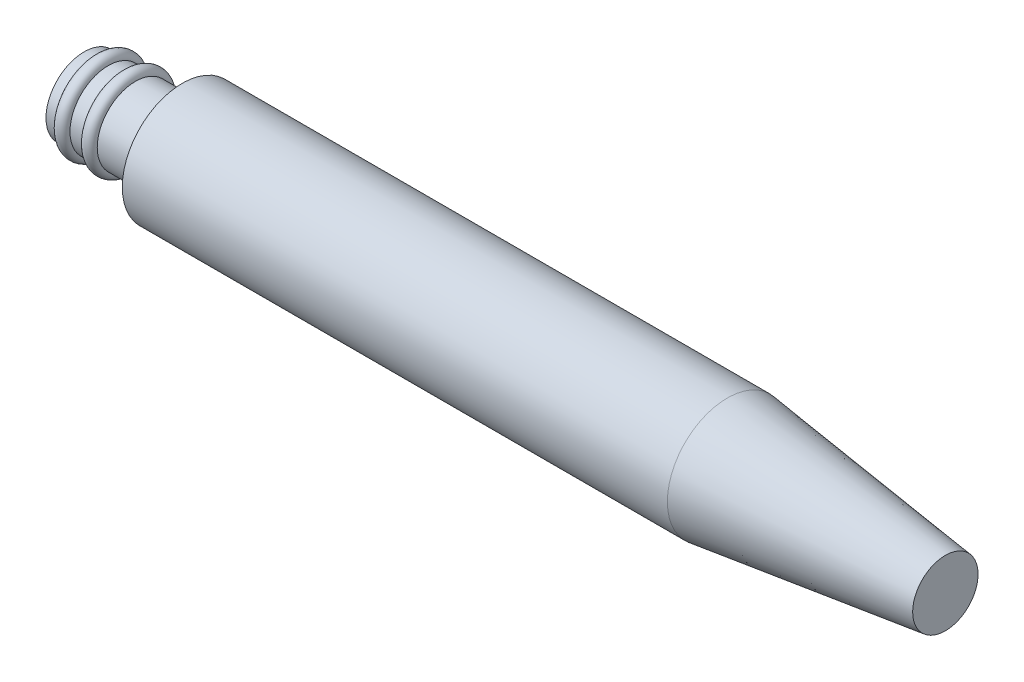
ISO-10303-21;
HEADER;
FILE_DESCRIPTION(('STEP AP214'),'2;1');
FILE_NAME('part.step','',(''),(''),'','','');
FILE_SCHEMA(('AUTOMOTIVE_DESIGN { 1 0 10303 214 1 1 1 1 }'));
ENDSEC;
DATA;
#1=APPLICATION_CONTEXT('core data for automotive mechanical design processes');
#2=APPLICATION_PROTOCOL_DEFINITION('international standard','automotive_design',2000,#1);
#3=PRODUCT_CONTEXT('',#1,'mechanical');
#4=PRODUCT('Part','Part','',(#3));
#5=PRODUCT_RELATED_PRODUCT_CATEGORY('part','',(#4));
#6=PRODUCT_DEFINITION_FORMATION('','',#4);
#7=PRODUCT_DEFINITION_CONTEXT('part definition',#1,'design');
#8=PRODUCT_DEFINITION('design','',#6,#7);
#9=PRODUCT_DEFINITION_SHAPE('','',#8);
#10=(LENGTH_UNIT() NAMED_UNIT(*) SI_UNIT(.MILLI.,.METRE.));
#11=(NAMED_UNIT(*) PLANE_ANGLE_UNIT() SI_UNIT($,.RADIAN.));
#12=(NAMED_UNIT(*) SI_UNIT($,.STERADIAN.) SOLID_ANGLE_UNIT());
#13=UNCERTAINTY_MEASURE_WITH_UNIT(LENGTH_MEASURE(1.E-05),#10,'distance_accuracy_value','');
#14=(GEOMETRIC_REPRESENTATION_CONTEXT(3) GLOBAL_UNCERTAINTY_ASSIGNED_CONTEXT((#13)) GLOBAL_UNIT_ASSIGNED_CONTEXT((#10,
#11,#12)) REPRESENTATION_CONTEXT('',''));
#15=CARTESIAN_POINT('',(0.,0.,0.));
#16=DIRECTION('',(0.,0.,1.));
#17=DIRECTION('',(1.,0.,0.));
#18=AXIS2_PLACEMENT_3D('',#15,#16,#17);
#19=CARTESIAN_POINT('',(172.575672519505,153.812567330873,0.));
#20=DIRECTION('',(-1.,0.,0.));
#21=DIRECTION('',(0.,0.,1.));
#22=AXIS2_PLACEMENT_3D('',#19,#20,#21);
#23=TOROIDAL_SURFACE('',#22,0.889000000000001,0.152399999999997);
#24=CARTESIAN_POINT('',(172.423272519505,153.812567330873,0.));
#25=DIRECTION('',(-1.,0.,0.));
#26=DIRECTION('',(0.,0.,1.));
#27=AXIS2_PLACEMENT_3D('',#24,#25,#26);
#28=CIRCLE('',#27,0.889000000000001);
#29=CARTESIAN_POINT('',(172.423272519505,153.812567330873,0.889000000000017));
#30=VERTEX_POINT('',#29);
#31=EDGE_CURVE('E10',#30,#30,#28,.T.);
#32=ORIENTED_EDGE('',*,*,#31,.F.);
#33=EDGE_LOOP('',(#32));
#34=FACE_BOUND('',#33,.T.);
#35=CARTESIAN_POINT('',(172.728072519505,153.812567330873,0.));
#36=DIRECTION('',(-1.,0.,0.));
#37=DIRECTION('',(0.,0.,1.));
#38=AXIS2_PLACEMENT_3D('',#35,#36,#37);
#39=CIRCLE('',#38,0.889000000000001);
#40=CARTESIAN_POINT('',(172.728072519505,153.812567330873,0.889000000000017));
#41=VERTEX_POINT('',#40);
#42=EDGE_CURVE('E80',#41,#41,#39,.T.);
#43=ORIENTED_EDGE('',*,*,#42,.T.);
#44=EDGE_LOOP('',(#43));
#45=FACE_BOUND('',#44,.T.);
#46=ADVANCED_FACE('F41',(#34,#45),#23,.T.);
#47=CARTESIAN_POINT('',(172.169272519505,153.812567330873,0.));
#48=DIRECTION('',(-1.,0.,0.));
#49=DIRECTION('',(0.,0.,1.));
#50=AXIS2_PLACEMENT_3D('',#47,#48,#49);
#51=CYLINDRICAL_SURFACE('',#50,0.889000000000001);
#52=CARTESIAN_POINT('',(172.169272519505,153.812567330873,0.));
#53=DIRECTION('',(-1.,0.,0.));
#54=DIRECTION('',(0.,0.,1.));
#55=AXIS2_PLACEMENT_3D('',#52,#53,#54);
#56=CIRCLE('',#55,0.889000000000001);
#57=CARTESIAN_POINT('',(172.169272519505,153.812567330873,0.889000000000017));
#58=VERTEX_POINT('',#57);
#59=EDGE_CURVE('E48',#58,#58,#56,.T.);
#60=ORIENTED_EDGE('',*,*,#59,.F.);
#61=EDGE_LOOP('',(#60));
#62=FACE_BOUND('',#61,.T.);
#63=ORIENTED_EDGE('',*,*,#31,.T.);
#64=EDGE_LOOP('',(#63));
#65=FACE_BOUND('',#64,.T.);
#66=ADVANCED_FACE('F129',(#62,#65),#51,.T.);
#67=CARTESIAN_POINT('',(172.169272519505,154.701567330873,0.));
#68=DIRECTION('',(1.,0.,0.));
#69=DIRECTION('',(0.,0.,-1.));
#70=AXIS2_PLACEMENT_3D('',#67,#68,#69);
#71=PLANE('',#70);
#72=ORIENTED_EDGE('',*,*,#59,.T.);
#73=EDGE_LOOP('',(#72));
#74=FACE_BOUND('',#73,.T.);
#75=ADVANCED_FACE('F124',(#74),#71,.F.);
#76=CARTESIAN_POINT('',(192.235272519505,154.574567330873,0.));
#77=DIRECTION('',(-1.,0.,0.));
#78=DIRECTION('',(0.,0.,1.));
#79=AXIS2_PLACEMENT_3D('',#76,#77,#78);
#80=PLANE('',#79);
#81=CARTESIAN_POINT('',(192.235272519505,153.812567330873,0.));
#82=DIRECTION('',(-1.,0.,0.));
#83=DIRECTION('',(0.,0.,1.));
#84=AXIS2_PLACEMENT_3D('',#81,#82,#83);
#85=CIRCLE('',#84,0.762000000000013);
#86=CARTESIAN_POINT('',(192.235272519505,153.812567330873,0.762000000000028));
#87=VERTEX_POINT('',#86);
#88=EDGE_CURVE('E53',#87,#87,#85,.T.);
#89=ORIENTED_EDGE('',*,*,#88,.F.);
#90=EDGE_LOOP('',(#89));
#91=FACE_BOUND('',#90,.T.);
#92=ADVANCED_FACE('F119',(#91),#80,.F.);
#93=CARTESIAN_POINT('',(192.235272519505,153.812567330873,0.));
#94=DIRECTION('',(-1.,0.,0.));
#95=DIRECTION('',(0.,0.,1.));
#96=AXIS2_PLACEMENT_3D('',#93,#94,#95);
#97=CONICAL_SURFACE('',#96,0.762000000000013,0.124354994546761);
#98=CARTESIAN_POINT('',(187.155272519505,153.812567330873,0.));
#99=DIRECTION('',(-1.,0.,0.));
#100=DIRECTION('',(0.,0.,1.));
#101=AXIS2_PLACEMENT_3D('',#98,#99,#100);
#102=CIRCLE('',#101,1.39700000000001);
#103=CARTESIAN_POINT('',(187.155272519505,153.812567330873,1.39700000000003));
#104=VERTEX_POINT('',#103);
#105=EDGE_CURVE('E58',#104,#104,#102,.T.);
#106=ORIENTED_EDGE('',*,*,#105,.F.);
#107=EDGE_LOOP('',(#106));
#108=FACE_BOUND('',#107,.T.);
#109=ORIENTED_EDGE('',*,*,#88,.T.);
#110=EDGE_LOOP('',(#109));
#111=FACE_BOUND('',#110,.T.);
#112=ADVANCED_FACE('F113',(#108,#111),#97,.T.);
#113=CARTESIAN_POINT('',(172.169272519505,153.812567330873,0.));
#114=DIRECTION('',(-1.,0.,0.));
#115=DIRECTION('',(0.,0.,1.));
#116=AXIS2_PLACEMENT_3D('',#113,#114,#115);
#117=CYLINDRICAL_SURFACE('',#116,1.39700000000001);
#118=CARTESIAN_POINT('',(174.455272519505,153.812567330873,0.));
#119=DIRECTION('',(-1.,0.,0.));
#120=DIRECTION('',(0.,0.,1.));
#121=AXIS2_PLACEMENT_3D('',#118,#119,#120);
#122=CIRCLE('',#121,1.39700000000001);
#123=CARTESIAN_POINT('',(174.455272519505,153.812567330873,1.39700000000003));
#124=VERTEX_POINT('',#123);
#125=EDGE_CURVE('E64',#124,#124,#122,.T.);
#126=ORIENTED_EDGE('',*,*,#125,.F.);
#127=EDGE_LOOP('',(#126));
#128=FACE_BOUND('',#127,.T.);
#129=ORIENTED_EDGE('',*,*,#105,.T.);
#130=EDGE_LOOP('',(#129));
#131=FACE_BOUND('',#130,.T.);
#132=ADVANCED_FACE('F107',(#128,#131),#117,.T.);
#133=CARTESIAN_POINT('',(174.455272519505,154.701567330873,0.));
#134=DIRECTION('',(1.,0.,0.));
#135=DIRECTION('',(0.,0.,-1.));
#136=AXIS2_PLACEMENT_3D('',#133,#134,#135);
#137=PLANE('',#136);
#138=CARTESIAN_POINT('',(174.455272519505,153.812567330873,0.));
#139=DIRECTION('',(-1.,0.,0.));
#140=DIRECTION('',(0.,0.,1.));
#141=AXIS2_PLACEMENT_3D('',#138,#139,#140);
#142=CIRCLE('',#141,0.889000000000001);
#143=CARTESIAN_POINT('',(174.455272519505,153.812567330873,0.889000000000017));
#144=VERTEX_POINT('',#143);
#145=EDGE_CURVE('E68',#144,#144,#142,.T.);
#146=ORIENTED_EDGE('',*,*,#145,.F.);
#147=EDGE_LOOP('',(#146));
#148=FACE_BOUND('',#147,.T.);
#149=ORIENTED_EDGE('',*,*,#125,.T.);
#150=EDGE_LOOP('',(#149));
#151=FACE_BOUND('',#150,.T.);
#152=ADVANCED_FACE('F101',(#148,#151),#137,.F.);
#153=CARTESIAN_POINT('',(172.169272519505,153.812567330873,0.));
#154=DIRECTION('',(-1.,0.,0.));
#155=DIRECTION('',(0.,0.,1.));
#156=AXIS2_PLACEMENT_3D('',#153,#154,#155);
#157=CYLINDRICAL_SURFACE('',#156,0.889000000000001);
#158=CARTESIAN_POINT('',(173.363072519505,153.812567330873,0.));
#159=DIRECTION('',(-1.,0.,0.));
#160=DIRECTION('',(0.,0.,1.));
#161=AXIS2_PLACEMENT_3D('',#158,#159,#160);
#162=CIRCLE('',#161,0.889000000000001);
#163=CARTESIAN_POINT('',(173.363072519505,153.812567330873,0.889000000000017));
#164=VERTEX_POINT('',#163);
#165=EDGE_CURVE('E72',#164,#164,#162,.T.);
#166=ORIENTED_EDGE('',*,*,#165,.F.);
#167=EDGE_LOOP('',(#166));
#168=FACE_BOUND('',#167,.T.);
#169=ORIENTED_EDGE('',*,*,#145,.T.);
#170=EDGE_LOOP('',(#169));
#171=FACE_BOUND('',#170,.T.);
#172=ADVANCED_FACE('F95',(#168,#171),#157,.T.);
#173=CARTESIAN_POINT('',(173.210672519505,153.812567330873,0.));
#174=DIRECTION('',(-1.,0.,0.));
#175=DIRECTION('',(0.,0.,1.));
#176=AXIS2_PLACEMENT_3D('',#173,#174,#175);
#177=TOROIDAL_SURFACE('',#176,0.889000000000001,0.152399999999997);
#178=CARTESIAN_POINT('',(173.058272519505,153.812567330873,0.));
#179=DIRECTION('',(-1.,0.,0.));
#180=DIRECTION('',(0.,0.,1.));
#181=AXIS2_PLACEMENT_3D('',#178,#179,#180);
#182=CIRCLE('',#181,0.889000000000001);
#183=CARTESIAN_POINT('',(173.058272519505,153.812567330873,0.889000000000017));
#184=VERTEX_POINT('',#183);
#185=EDGE_CURVE('E76',#184,#184,#182,.T.);
#186=ORIENTED_EDGE('',*,*,#185,.F.);
#187=EDGE_LOOP('',(#186));
#188=FACE_BOUND('',#187,.T.);
#189=ORIENTED_EDGE('',*,*,#165,.T.);
#190=EDGE_LOOP('',(#189));
#191=FACE_BOUND('',#190,.T.);
#192=ADVANCED_FACE('F89',(#188,#191),#177,.T.);
#193=CARTESIAN_POINT('',(172.169272519505,153.812567330873,0.));
#194=DIRECTION('',(-1.,0.,0.));
#195=DIRECTION('',(0.,0.,1.));
#196=AXIS2_PLACEMENT_3D('',#193,#194,#195);
#197=CYLINDRICAL_SURFACE('',#196,0.889000000000001);
#198=ORIENTED_EDGE('',*,*,#42,.F.);
#199=EDGE_LOOP('',(#198));
#200=FACE_BOUND('',#199,.T.);
#201=ORIENTED_EDGE('',*,*,#185,.T.);
#202=EDGE_LOOP('',(#201));
#203=FACE_BOUND('',#202,.T.);
#204=ADVANCED_FACE('F86',(#200,#203),#197,.T.);
#205=CLOSED_SHELL('',(#46,#66,#75,#92,#112,#132,#152,#172,#192,#204));
#206=MANIFOLD_SOLID_BREP('B2',#205);
#207=ADVANCED_BREP_SHAPE_REPRESENTATION('',(#18,#206),#14);
#208=SHAPE_DEFINITION_REPRESENTATION(#9,#207);
ENDSEC;
END-ISO-10303-21;
